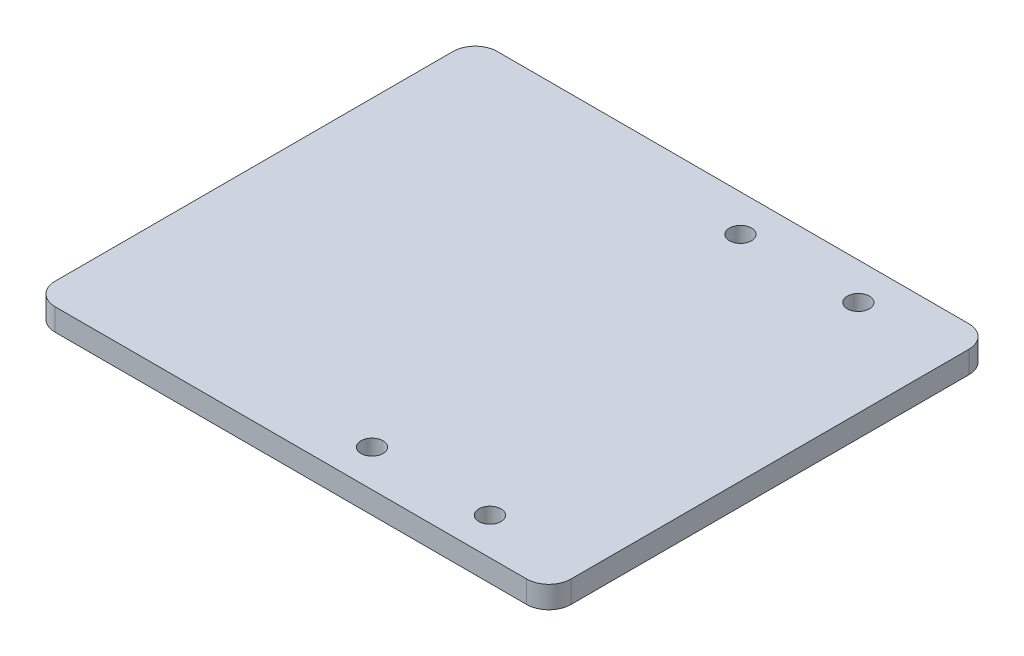
ISO-10303-21;
HEADER;
FILE_DESCRIPTION(('STEP AP214'),'2;1');
FILE_NAME('part.step','',(''),(''),'','','');
FILE_SCHEMA(('AUTOMOTIVE_DESIGN { 1 0 10303 214 1 1 1 1 }'));
ENDSEC;
DATA;
#1=APPLICATION_CONTEXT('core data for automotive mechanical design processes');
#2=APPLICATION_PROTOCOL_DEFINITION('international standard','automotive_design',2000,#1);
#3=PRODUCT_CONTEXT('',#1,'mechanical');
#4=PRODUCT('Part','Part','',(#3));
#5=PRODUCT_RELATED_PRODUCT_CATEGORY('part','',(#4));
#6=PRODUCT_DEFINITION_FORMATION('','',#4);
#7=PRODUCT_DEFINITION_CONTEXT('part definition',#1,'design');
#8=PRODUCT_DEFINITION('design','',#6,#7);
#9=PRODUCT_DEFINITION_SHAPE('','',#8);
#10=(LENGTH_UNIT() NAMED_UNIT(*) SI_UNIT(.MILLI.,.METRE.));
#11=(NAMED_UNIT(*) PLANE_ANGLE_UNIT() SI_UNIT($,.RADIAN.));
#12=(NAMED_UNIT(*) SI_UNIT($,.STERADIAN.) SOLID_ANGLE_UNIT());
#13=UNCERTAINTY_MEASURE_WITH_UNIT(LENGTH_MEASURE(1.E-05),#10,'distance_accuracy_value','');
#14=(GEOMETRIC_REPRESENTATION_CONTEXT(3) GLOBAL_UNCERTAINTY_ASSIGNED_CONTEXT((#13)) GLOBAL_UNIT_ASSIGNED_CONTEXT((#10,
#11,#12)) REPRESENTATION_CONTEXT('',''));
#15=CARTESIAN_POINT('',(0.,0.,0.));
#16=DIRECTION('',(0.,0.,1.));
#17=DIRECTION('',(1.,0.,0.));
#18=AXIS2_PLACEMENT_3D('',#15,#16,#17);
#19=CARTESIAN_POINT('',(0.,3.,0.));
#20=DIRECTION('',(1.,0.,0.));
#21=DIRECTION('',(0.,0.,-1.));
#22=AXIS2_PLACEMENT_3D('',#19,#20,#21);
#23=PLANE('',#22);
#24=DIRECTION('',(0.,0.,1.));
#25=VECTOR('',#24,1.);
#26=CARTESIAN_POINT('',(0.,0.,0.));
#27=LINE('',#26,#25);
#28=CARTESIAN_POINT('',(0.,0.,3.));
#29=VERTEX_POINT('',#28);
#30=CARTESIAN_POINT('',(0.,0.,57.));
#31=VERTEX_POINT('',#30);
#32=EDGE_CURVE('E128',#29,#31,#27,.T.);
#33=ORIENTED_EDGE('',*,*,#32,.T.);
#34=DIRECTION('',(0.,-1.,0.));
#35=VECTOR('',#34,1.);
#36=CARTESIAN_POINT('',(0.,3.,57.));
#37=LINE('',#36,#35);
#38=CARTESIAN_POINT('',(0.,3.,57.));
#39=VERTEX_POINT('',#38);
#40=EDGE_CURVE('E106',#31,#39,#37,.F.);
#41=ORIENTED_EDGE('',*,*,#40,.T.);
#42=DIRECTION('',(0.,0.,1.));
#43=VECTOR('',#42,1.);
#44=CARTESIAN_POINT('',(0.,3.,0.));
#45=LINE('',#44,#43);
#46=CARTESIAN_POINT('',(0.,3.,3.));
#47=VERTEX_POINT('',#46);
#48=EDGE_CURVE('E138',#47,#39,#45,.T.);
#49=ORIENTED_EDGE('',*,*,#48,.F.);
#50=DIRECTION('',(0.,-1.,0.));
#51=VECTOR('',#50,1.);
#52=CARTESIAN_POINT('',(0.,3.,3.));
#53=LINE('',#52,#51);
#54=EDGE_CURVE('E111',#47,#29,#53,.T.);
#55=ORIENTED_EDGE('',*,*,#54,.T.);
#56=EDGE_LOOP('',(#33,#41,#49,#55));
#57=FACE_BOUND('',#56,.T.);
#58=ADVANCED_FACE('F35',(#57),#23,.F.);
#59=CARTESIAN_POINT('',(0.,3.,60.));
#60=DIRECTION('',(0.,0.,-1.));
#61=DIRECTION('',(-1.,0.,0.));
#62=AXIS2_PLACEMENT_3D('',#59,#60,#61);
#63=PLANE('',#62);
#64=DIRECTION('',(1.,0.,0.));
#65=VECTOR('',#64,1.);
#66=CARTESIAN_POINT('',(0.,3.,60.));
#67=LINE('',#66,#65);
#68=CARTESIAN_POINT('',(3.,3.,60.));
#69=VERTEX_POINT('',#68);
#70=CARTESIAN_POINT('',(67.,3.,60.));
#71=VERTEX_POINT('',#70);
#72=EDGE_CURVE('E121',#69,#71,#67,.T.);
#73=ORIENTED_EDGE('',*,*,#72,.F.);
#74=DIRECTION('',(0.,-1.,0.));
#75=VECTOR('',#74,1.);
#76=CARTESIAN_POINT('',(3.,3.,60.));
#77=LINE('',#76,#75);
#78=CARTESIAN_POINT('',(3.,0.,60.));
#79=VERTEX_POINT('',#78);
#80=EDGE_CURVE('E105',#69,#79,#77,.T.);
#81=ORIENTED_EDGE('',*,*,#80,.T.);
#82=DIRECTION('',(1.,0.,0.));
#83=VECTOR('',#82,1.);
#84=CARTESIAN_POINT('',(0.,0.,60.));
#85=LINE('',#84,#83);
#86=CARTESIAN_POINT('',(67.,0.,60.));
#87=VERTEX_POINT('',#86);
#88=EDGE_CURVE('E118',#79,#87,#85,.T.);
#89=ORIENTED_EDGE('',*,*,#88,.T.);
#90=DIRECTION('',(0.,-1.,0.));
#91=VECTOR('',#90,1.);
#92=CARTESIAN_POINT('',(67.,3.,60.));
#93=LINE('',#92,#91);
#94=EDGE_CURVE('E123',#87,#71,#93,.F.);
#95=ORIENTED_EDGE('',*,*,#94,.T.);
#96=EDGE_LOOP('',(#73,#81,#89,#95));
#97=FACE_BOUND('',#96,.T.);
#98=ADVANCED_FACE('F117',(#97),#63,.F.);
#99=CARTESIAN_POINT('',(70.,3.,0.));
#100=DIRECTION('',(-1.,0.,0.));
#101=DIRECTION('',(0.,0.,1.));
#102=AXIS2_PLACEMENT_3D('',#99,#100,#101);
#103=PLANE('',#102);
#104=DIRECTION('',(0.,0.,-1.));
#105=VECTOR('',#104,1.);
#106=CARTESIAN_POINT('',(70.,0.,0.));
#107=LINE('',#106,#105);
#108=CARTESIAN_POINT('',(70.,0.,57.));
#109=VERTEX_POINT('',#108);
#110=CARTESIAN_POINT('',(70.,0.,3.));
#111=VERTEX_POINT('',#110);
#112=EDGE_CURVE('E127',#109,#111,#107,.T.);
#113=ORIENTED_EDGE('',*,*,#112,.T.);
#114=DIRECTION('',(0.,-1.,0.));
#115=VECTOR('',#114,1.);
#116=CARTESIAN_POINT('',(70.,3.,3.));
#117=LINE('',#116,#115);
#118=CARTESIAN_POINT('',(70.,3.,3.));
#119=VERTEX_POINT('',#118);
#120=EDGE_CURVE('E11',#111,#119,#117,.F.);
#121=ORIENTED_EDGE('',*,*,#120,.T.);
#122=DIRECTION('',(0.,0.,-1.));
#123=VECTOR('',#122,1.);
#124=CARTESIAN_POINT('',(70.,3.,0.));
#125=LINE('',#124,#123);
#126=CARTESIAN_POINT('',(70.,3.,57.));
#127=VERTEX_POINT('',#126);
#128=EDGE_CURVE('E164',#127,#119,#125,.T.);
#129=ORIENTED_EDGE('',*,*,#128,.F.);
#130=DIRECTION('',(0.,-1.,0.));
#131=VECTOR('',#130,1.);
#132=CARTESIAN_POINT('',(70.,3.,57.));
#133=LINE('',#132,#131);
#134=EDGE_CURVE('E43',#127,#109,#133,.T.);
#135=ORIENTED_EDGE('',*,*,#134,.T.);
#136=EDGE_LOOP('',(#113,#121,#129,#135));
#137=FACE_BOUND('',#136,.T.);
#138=ADVANCED_FACE('F162',(#137),#103,.F.);
#139=CARTESIAN_POINT('',(0.,3.,0.));
#140=DIRECTION('',(0.,0.,1.));
#141=DIRECTION('',(1.,0.,0.));
#142=AXIS2_PLACEMENT_3D('',#139,#140,#141);
#143=PLANE('',#142);
#144=DIRECTION('',(-1.,0.,0.));
#145=VECTOR('',#144,1.);
#146=CARTESIAN_POINT('',(0.,0.,0.));
#147=LINE('',#146,#145);
#148=CARTESIAN_POINT('',(67.,0.,0.));
#149=VERTEX_POINT('',#148);
#150=CARTESIAN_POINT('',(3.,0.,0.));
#151=VERTEX_POINT('',#150);
#152=EDGE_CURVE('E131',#149,#151,#147,.T.);
#153=ORIENTED_EDGE('',*,*,#152,.T.);
#154=DIRECTION('',(0.,-1.,0.));
#155=VECTOR('',#154,1.);
#156=CARTESIAN_POINT('',(3.,3.,0.));
#157=LINE('',#156,#155);
#158=CARTESIAN_POINT('',(3.,3.,0.));
#159=VERTEX_POINT('',#158);
#160=EDGE_CURVE('E50',#151,#159,#157,.F.);
#161=ORIENTED_EDGE('',*,*,#160,.T.);
#162=DIRECTION('',(-1.,0.,0.));
#163=VECTOR('',#162,1.);
#164=CARTESIAN_POINT('',(0.,3.,0.));
#165=LINE('',#164,#163);
#166=CARTESIAN_POINT('',(67.,3.,0.));
#167=VERTEX_POINT('',#166);
#168=EDGE_CURVE('E139',#167,#159,#165,.T.);
#169=ORIENTED_EDGE('',*,*,#168,.F.);
#170=DIRECTION('',(0.,-1.,0.));
#171=VECTOR('',#170,1.);
#172=CARTESIAN_POINT('',(67.,3.,0.));
#173=LINE('',#172,#171);
#174=EDGE_CURVE('E155',#167,#149,#173,.T.);
#175=ORIENTED_EDGE('',*,*,#174,.T.);
#176=EDGE_LOOP('',(#153,#161,#169,#175));
#177=FACE_BOUND('',#176,.T.);
#178=ADVANCED_FACE('F171',(#177),#143,.F.);
#179=CARTESIAN_POINT('',(0.,3.,0.));
#180=DIRECTION('',(0.,1.,0.));
#181=DIRECTION('',(0.,0.,1.));
#182=AXIS2_PLACEMENT_3D('',#179,#180,#181);
#183=PLANE('',#182);
#184=CARTESIAN_POINT('',(41.,3.,4.99999999999928));
#185=DIRECTION('',(0.,1.,0.));
#186=DIRECTION('',(0.,0.,1.));
#187=AXIS2_PLACEMENT_3D('',#184,#185,#186);
#188=CIRCLE('',#187,1.5);
#189=CARTESIAN_POINT('',(41.,3.,6.49999999999928));
#190=VERTEX_POINT('',#189);
#191=EDGE_CURVE('E191',#190,#190,#188,.T.);
#192=ORIENTED_EDGE('',*,*,#191,.F.);
#193=EDGE_LOOP('',(#192));
#194=FACE_BOUND('',#193,.T.);
#195=CARTESIAN_POINT('',(57.0000000000001,3.,54.9999999999992));
#196=DIRECTION('',(0.,1.,0.));
#197=DIRECTION('',(0.,0.,1.));
#198=AXIS2_PLACEMENT_3D('',#195,#196,#197);
#199=CIRCLE('',#198,1.5);
#200=CARTESIAN_POINT('',(57.0000000000001,3.,56.4999999999992));
#201=VERTEX_POINT('',#200);
#202=EDGE_CURVE('E184',#201,#201,#199,.T.);
#203=ORIENTED_EDGE('',*,*,#202,.F.);
#204=EDGE_LOOP('',(#203));
#205=FACE_BOUND('',#204,.T.);
#206=CARTESIAN_POINT('',(41.0000000000001,3.,54.9999999999993));
#207=DIRECTION('',(0.,1.,0.));
#208=DIRECTION('',(0.,0.,1.));
#209=AXIS2_PLACEMENT_3D('',#206,#207,#208);
#210=CIRCLE('',#209,1.5);
#211=CARTESIAN_POINT('',(41.0000000000001,3.,56.4999999999993));
#212=VERTEX_POINT('',#211);
#213=EDGE_CURVE('E196',#212,#212,#210,.T.);
#214=ORIENTED_EDGE('',*,*,#213,.F.);
#215=EDGE_LOOP('',(#214));
#216=FACE_BOUND('',#215,.T.);
#217=CARTESIAN_POINT('',(57.,3.,4.99999999999925));
#218=DIRECTION('',(0.,1.,0.));
#219=DIRECTION('',(0.,0.,1.));
#220=AXIS2_PLACEMENT_3D('',#217,#218,#219);
#221=CIRCLE('',#220,1.5);
#222=CARTESIAN_POINT('',(57.,3.,6.49999999999925));
#223=VERTEX_POINT('',#222);
#224=EDGE_CURVE('E178',#223,#223,#221,.T.);
#225=ORIENTED_EDGE('',*,*,#224,.F.);
#226=EDGE_LOOP('',(#225));
#227=FACE_BOUND('',#226,.T.);
#228=ORIENTED_EDGE('',*,*,#48,.T.);
#229=CARTESIAN_POINT('',(3.,3.,57.));
#230=DIRECTION('',(0.,1.,0.));
#231=DIRECTION('',(0.,0.,1.));
#232=AXIS2_PLACEMENT_3D('',#229,#230,#231);
#233=CIRCLE('',#232,3.);
#234=EDGE_CURVE('E153',#39,#69,#233,.T.);
#235=ORIENTED_EDGE('',*,*,#234,.T.);
#236=ORIENTED_EDGE('',*,*,#72,.T.);
#237=CARTESIAN_POINT('',(67.,3.,57.));
#238=DIRECTION('',(0.,1.,0.));
#239=DIRECTION('',(0.,0.,1.));
#240=AXIS2_PLACEMENT_3D('',#237,#238,#239);
#241=CIRCLE('',#240,3.);
#242=EDGE_CURVE('E148',#71,#127,#241,.T.);
#243=ORIENTED_EDGE('',*,*,#242,.T.);
#244=ORIENTED_EDGE('',*,*,#128,.T.);
#245=CARTESIAN_POINT('',(67.,3.,3.));
#246=DIRECTION('',(0.,1.,0.));
#247=DIRECTION('',(0.,0.,1.));
#248=AXIS2_PLACEMENT_3D('',#245,#246,#247);
#249=CIRCLE('',#248,3.);
#250=EDGE_CURVE('E57',#119,#167,#249,.T.);
#251=ORIENTED_EDGE('',*,*,#250,.T.);
#252=ORIENTED_EDGE('',*,*,#168,.T.);
#253=CARTESIAN_POINT('',(3.,3.,3.));
#254=DIRECTION('',(0.,1.,0.));
#255=DIRECTION('',(0.,0.,1.));
#256=AXIS2_PLACEMENT_3D('',#253,#254,#255);
#257=CIRCLE('',#256,3.);
#258=EDGE_CURVE('E151',#159,#47,#257,.T.);
#259=ORIENTED_EDGE('',*,*,#258,.T.);
#260=EDGE_LOOP('',(#228,#235,#236,#243,#244,#251,#252,#259));
#261=FACE_BOUND('',#260,.T.);
#262=ADVANCED_FACE('F212',(#194,#205,#216,#227,#261),#183,.T.);
#263=CARTESIAN_POINT('',(0.,0.,0.));
#264=DIRECTION('',(0.,1.,0.));
#265=DIRECTION('',(0.,0.,1.));
#266=AXIS2_PLACEMENT_3D('',#263,#264,#265);
#267=PLANE('',#266);
#268=CARTESIAN_POINT('',(41.,0.,4.99999999999928));
#269=DIRECTION('',(0.,1.,0.));
#270=DIRECTION('',(0.,0.,1.));
#271=AXIS2_PLACEMENT_3D('',#268,#269,#270);
#272=CIRCLE('',#271,1.5);
#273=CARTESIAN_POINT('',(41.,0.,6.49999999999928));
#274=VERTEX_POINT('',#273);
#275=EDGE_CURVE('E181',#274,#274,#272,.T.);
#276=ORIENTED_EDGE('',*,*,#275,.T.);
#277=EDGE_LOOP('',(#276));
#278=FACE_BOUND('',#277,.T.);
#279=CARTESIAN_POINT('',(57.0000000000001,0.,54.9999999999992));
#280=DIRECTION('',(0.,1.,0.));
#281=DIRECTION('',(0.,0.,1.));
#282=AXIS2_PLACEMENT_3D('',#279,#280,#281);
#283=CIRCLE('',#282,1.5);
#284=CARTESIAN_POINT('',(57.0000000000001,0.,56.4999999999992));
#285=VERTEX_POINT('',#284);
#286=EDGE_CURVE('E187',#285,#285,#283,.T.);
#287=ORIENTED_EDGE('',*,*,#286,.T.);
#288=EDGE_LOOP('',(#287));
#289=FACE_BOUND('',#288,.T.);
#290=CARTESIAN_POINT('',(41.0000000000001,0.,54.9999999999993));
#291=DIRECTION('',(0.,1.,0.));
#292=DIRECTION('',(0.,0.,1.));
#293=AXIS2_PLACEMENT_3D('',#290,#291,#292);
#294=CIRCLE('',#293,1.5);
#295=CARTESIAN_POINT('',(41.0000000000001,0.,56.4999999999993));
#296=VERTEX_POINT('',#295);
#297=EDGE_CURVE('E188',#296,#296,#294,.T.);
#298=ORIENTED_EDGE('',*,*,#297,.T.);
#299=EDGE_LOOP('',(#298));
#300=FACE_BOUND('',#299,.T.);
#301=CARTESIAN_POINT('',(57.,0.,4.99999999999925));
#302=DIRECTION('',(0.,1.,0.));
#303=DIRECTION('',(0.,0.,1.));
#304=AXIS2_PLACEMENT_3D('',#301,#302,#303);
#305=CIRCLE('',#304,1.5);
#306=CARTESIAN_POINT('',(57.,0.,6.49999999999925));
#307=VERTEX_POINT('',#306);
#308=EDGE_CURVE('E133',#307,#307,#305,.T.);
#309=ORIENTED_EDGE('',*,*,#308,.T.);
#310=EDGE_LOOP('',(#309));
#311=FACE_BOUND('',#310,.T.);
#312=ORIENTED_EDGE('',*,*,#88,.F.);
#313=CARTESIAN_POINT('',(3.,0.,57.));
#314=DIRECTION('',(0.,1.,0.));
#315=DIRECTION('',(0.,0.,1.));
#316=AXIS2_PLACEMENT_3D('',#313,#314,#315);
#317=CIRCLE('',#316,3.);
#318=EDGE_CURVE('E101',#79,#31,#317,.F.);
#319=ORIENTED_EDGE('',*,*,#318,.T.);
#320=ORIENTED_EDGE('',*,*,#32,.F.);
#321=CARTESIAN_POINT('',(3.,0.,3.));
#322=DIRECTION('',(0.,1.,0.));
#323=DIRECTION('',(0.,0.,1.));
#324=AXIS2_PLACEMENT_3D('',#321,#322,#323);
#325=CIRCLE('',#324,3.);
#326=EDGE_CURVE('E112',#29,#151,#325,.F.);
#327=ORIENTED_EDGE('',*,*,#326,.T.);
#328=ORIENTED_EDGE('',*,*,#152,.F.);
#329=CARTESIAN_POINT('',(67.,0.,3.));
#330=DIRECTION('',(0.,1.,0.));
#331=DIRECTION('',(0.,0.,1.));
#332=AXIS2_PLACEMENT_3D('',#329,#330,#331);
#333=CIRCLE('',#332,3.);
#334=EDGE_CURVE('E142',#149,#111,#333,.F.);
#335=ORIENTED_EDGE('',*,*,#334,.T.);
#336=ORIENTED_EDGE('',*,*,#112,.F.);
#337=CARTESIAN_POINT('',(67.,0.,57.));
#338=DIRECTION('',(0.,1.,0.));
#339=DIRECTION('',(0.,0.,1.));
#340=AXIS2_PLACEMENT_3D('',#337,#338,#339);
#341=CIRCLE('',#340,3.);
#342=EDGE_CURVE('E122',#109,#87,#341,.F.);
#343=ORIENTED_EDGE('',*,*,#342,.T.);
#344=EDGE_LOOP('',(#312,#319,#320,#327,#328,#335,#336,#343));
#345=FACE_BOUND('',#344,.T.);
#346=ADVANCED_FACE('F125',(#278,#289,#300,#311,#345),#267,.F.);
#347=CARTESIAN_POINT('',(57.,0.,4.99999999999925));
#348=DIRECTION('',(0.,1.,0.));
#349=DIRECTION('',(0.,0.,1.));
#350=AXIS2_PLACEMENT_3D('',#347,#348,#349);
#351=CYLINDRICAL_SURFACE('',#350,1.5);
#352=ORIENTED_EDGE('',*,*,#308,.F.);
#353=EDGE_LOOP('',(#352));
#354=FACE_BOUND('',#353,.T.);
#355=ORIENTED_EDGE('',*,*,#224,.T.);
#356=EDGE_LOOP('',(#355));
#357=FACE_BOUND('',#356,.T.);
#358=ADVANCED_FACE('F208',(#354,#357),#351,.F.);
#359=CARTESIAN_POINT('',(41.0000000000001,0.,54.9999999999993));
#360=DIRECTION('',(0.,1.,0.));
#361=DIRECTION('',(0.,0.,1.));
#362=AXIS2_PLACEMENT_3D('',#359,#360,#361);
#363=CYLINDRICAL_SURFACE('',#362,1.5);
#364=ORIENTED_EDGE('',*,*,#297,.F.);
#365=EDGE_LOOP('',(#364));
#366=FACE_BOUND('',#365,.T.);
#367=ORIENTED_EDGE('',*,*,#213,.T.);
#368=EDGE_LOOP('',(#367));
#369=FACE_BOUND('',#368,.T.);
#370=ADVANCED_FACE('F204',(#366,#369),#363,.F.);
#371=CARTESIAN_POINT('',(57.0000000000001,0.,54.9999999999992));
#372=DIRECTION('',(0.,1.,0.));
#373=DIRECTION('',(0.,0.,1.));
#374=AXIS2_PLACEMENT_3D('',#371,#372,#373);
#375=CYLINDRICAL_SURFACE('',#374,1.5);
#376=ORIENTED_EDGE('',*,*,#286,.F.);
#377=EDGE_LOOP('',(#376));
#378=FACE_BOUND('',#377,.T.);
#379=ORIENTED_EDGE('',*,*,#202,.T.);
#380=EDGE_LOOP('',(#379));
#381=FACE_BOUND('',#380,.T.);
#382=ADVANCED_FACE('F207',(#378,#381),#375,.F.);
#383=CARTESIAN_POINT('',(41.,0.,4.99999999999928));
#384=DIRECTION('',(0.,1.,0.));
#385=DIRECTION('',(0.,0.,1.));
#386=AXIS2_PLACEMENT_3D('',#383,#384,#385);
#387=CYLINDRICAL_SURFACE('',#386,1.5);
#388=ORIENTED_EDGE('',*,*,#275,.F.);
#389=EDGE_LOOP('',(#388));
#390=FACE_BOUND('',#389,.T.);
#391=ORIENTED_EDGE('',*,*,#191,.T.);
#392=EDGE_LOOP('',(#391));
#393=FACE_BOUND('',#392,.T.);
#394=ADVANCED_FACE('F229',(#390,#393),#387,.F.);
#395=CARTESIAN_POINT('',(3.,3.,57.));
#396=DIRECTION('',(0.,-1.,0.));
#397=DIRECTION('',(0.,0.,-1.));
#398=AXIS2_PLACEMENT_3D('',#395,#396,#397);
#399=CYLINDRICAL_SURFACE('',#398,3.);
#400=ORIENTED_EDGE('',*,*,#234,.F.);
#401=ORIENTED_EDGE('',*,*,#40,.F.);
#402=ORIENTED_EDGE('',*,*,#318,.F.);
#403=ORIENTED_EDGE('',*,*,#80,.F.);
#404=EDGE_LOOP('',(#400,#401,#402,#403));
#405=FACE_BOUND('',#404,.T.);
#406=ADVANCED_FACE('F104',(#405),#399,.T.);
#407=CARTESIAN_POINT('',(3.,3.,3.));
#408=DIRECTION('',(0.,-1.,0.));
#409=DIRECTION('',(0.,0.,-1.));
#410=AXIS2_PLACEMENT_3D('',#407,#408,#409);
#411=CYLINDRICAL_SURFACE('',#410,3.);
#412=ORIENTED_EDGE('',*,*,#258,.F.);
#413=ORIENTED_EDGE('',*,*,#160,.F.);
#414=ORIENTED_EDGE('',*,*,#326,.F.);
#415=ORIENTED_EDGE('',*,*,#54,.F.);
#416=EDGE_LOOP('',(#412,#413,#414,#415));
#417=FACE_BOUND('',#416,.T.);
#418=ADVANCED_FACE('F222',(#417),#411,.T.);
#419=CARTESIAN_POINT('',(67.,3.,3.));
#420=DIRECTION('',(0.,-1.,0.));
#421=DIRECTION('',(0.,0.,-1.));
#422=AXIS2_PLACEMENT_3D('',#419,#420,#421);
#423=CYLINDRICAL_SURFACE('',#422,3.);
#424=ORIENTED_EDGE('',*,*,#250,.F.);
#425=ORIENTED_EDGE('',*,*,#120,.F.);
#426=ORIENTED_EDGE('',*,*,#334,.F.);
#427=ORIENTED_EDGE('',*,*,#174,.F.);
#428=EDGE_LOOP('',(#424,#425,#426,#427));
#429=FACE_BOUND('',#428,.T.);
#430=ADVANCED_FACE('F170',(#429),#423,.T.);
#431=CARTESIAN_POINT('',(67.,3.,57.));
#432=DIRECTION('',(0.,-1.,0.));
#433=DIRECTION('',(0.,0.,-1.));
#434=AXIS2_PLACEMENT_3D('',#431,#432,#433);
#435=CYLINDRICAL_SURFACE('',#434,3.);
#436=ORIENTED_EDGE('',*,*,#242,.F.);
#437=ORIENTED_EDGE('',*,*,#94,.F.);
#438=ORIENTED_EDGE('',*,*,#342,.F.);
#439=ORIENTED_EDGE('',*,*,#134,.F.);
#440=EDGE_LOOP('',(#436,#437,#438,#439));
#441=FACE_BOUND('',#440,.T.);
#442=ADVANCED_FACE('F37',(#441),#435,.T.);
#443=CLOSED_SHELL('',(#58,#98,#138,#178,#262,#346,#358,#370,#382,#394,#406,#418,#430,#442));
#444=MANIFOLD_SOLID_BREP('B2',#443);
#445=ADVANCED_BREP_SHAPE_REPRESENTATION('',(#18,#444),#14);
#446=SHAPE_DEFINITION_REPRESENTATION(#9,#445);
ENDSEC;
END-ISO-10303-21;
